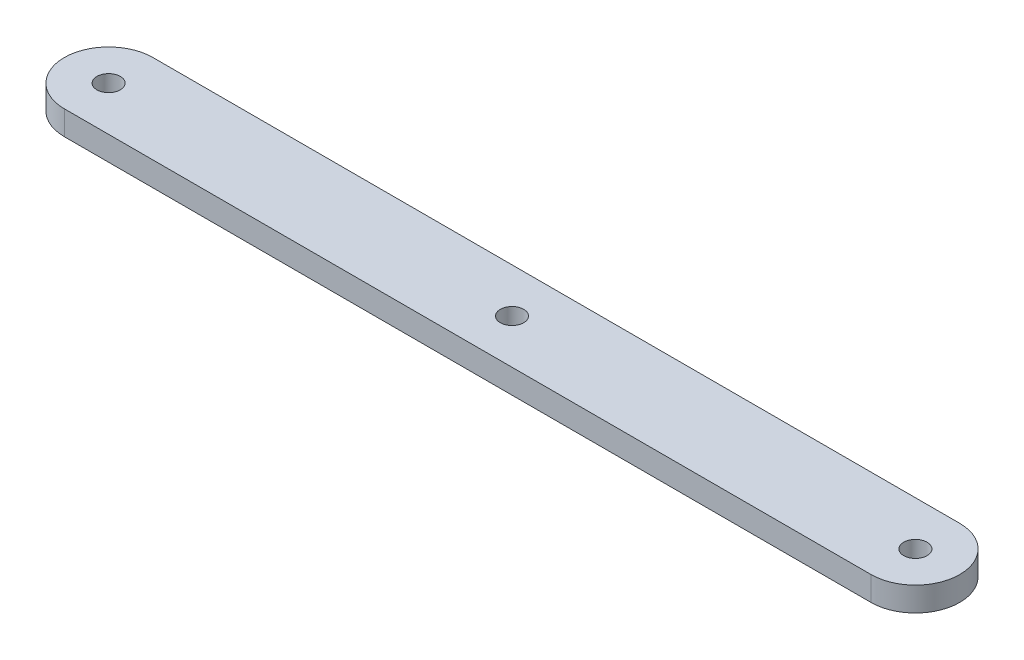
ISO-10303-21;
HEADER;
FILE_DESCRIPTION(('STEP AP214'),'2;1');
FILE_NAME('part.step','',(''),(''),'','','');
FILE_SCHEMA(('AUTOMOTIVE_DESIGN { 1 0 10303 214 1 1 1 1 }'));
ENDSEC;
DATA;
#1=APPLICATION_CONTEXT('core data for automotive mechanical design processes');
#2=APPLICATION_PROTOCOL_DEFINITION('international standard','automotive_design',2000,#1);
#3=PRODUCT_CONTEXT('',#1,'mechanical');
#4=PRODUCT('Part','Part','',(#3));
#5=PRODUCT_RELATED_PRODUCT_CATEGORY('part','',(#4));
#6=PRODUCT_DEFINITION_FORMATION('','',#4);
#7=PRODUCT_DEFINITION_CONTEXT('part definition',#1,'design');
#8=PRODUCT_DEFINITION('design','',#6,#7);
#9=PRODUCT_DEFINITION_SHAPE('','',#8);
#10=(LENGTH_UNIT() NAMED_UNIT(*) SI_UNIT(.MILLI.,.METRE.));
#11=(NAMED_UNIT(*) PLANE_ANGLE_UNIT() SI_UNIT($,.RADIAN.));
#12=(NAMED_UNIT(*) SI_UNIT($,.STERADIAN.) SOLID_ANGLE_UNIT());
#13=UNCERTAINTY_MEASURE_WITH_UNIT(LENGTH_MEASURE(1.E-05),#10,'distance_accuracy_value','');
#14=(GEOMETRIC_REPRESENTATION_CONTEXT(3) GLOBAL_UNCERTAINTY_ASSIGNED_CONTEXT((#13)) GLOBAL_UNIT_ASSIGNED_CONTEXT((#10,
#11,#12)) REPRESENTATION_CONTEXT('',''));
#15=CARTESIAN_POINT('',(0.,0.,0.));
#16=DIRECTION('',(0.,0.,1.));
#17=DIRECTION('',(1.,0.,0.));
#18=AXIS2_PLACEMENT_3D('',#15,#16,#17);
#19=CARTESIAN_POINT('',(0.,4.35,0.));
#20=DIRECTION('',(0.,1.,0.));
#21=DIRECTION('',(0.,0.,1.));
#22=AXIS2_PLACEMENT_3D('',#19,#20,#21);
#23=PLANE('',#22);
#24=CARTESIAN_POINT('',(72.52,4.35,0.));
#25=DIRECTION('',(0.,1.,0.));
#26=DIRECTION('',(0.,0.,1.));
#27=AXIS2_PLACEMENT_3D('',#24,#25,#26);
#28=CIRCLE('',#27,2.1);
#29=CARTESIAN_POINT('',(72.52,4.35,2.1));
#30=VERTEX_POINT('',#29);
#31=EDGE_CURVE('E117',#30,#30,#28,.T.);
#32=ORIENTED_EDGE('',*,*,#31,.F.);
#33=EDGE_LOOP('',(#32));
#34=FACE_BOUND('',#33,.T.);
#35=CARTESIAN_POINT('',(0.,4.35,0.));
#36=DIRECTION('',(0.,1.,0.));
#37=DIRECTION('',(0.,0.,1.));
#38=AXIS2_PLACEMENT_3D('',#35,#36,#37);
#39=CIRCLE('',#38,7.97347609683682);
#40=CARTESIAN_POINT('',(0.,4.35,-7.97347609683682));
#41=VERTEX_POINT('',#40);
#42=CARTESIAN_POINT('',(0.,4.35,7.97347609683682));
#43=VERTEX_POINT('',#42);
#44=EDGE_CURVE('E87',#41,#43,#39,.T.);
#45=ORIENTED_EDGE('',*,*,#44,.T.);
#46=DIRECTION('',(1.,0.,0.));
#47=VECTOR('',#46,1.);
#48=CARTESIAN_POINT('',(0.,4.35,7.97347609683682));
#49=LINE('',#48,#47);
#50=CARTESIAN_POINT('',(145.04,4.35,7.97347609683682));
#51=VERTEX_POINT('',#50);
#52=EDGE_CURVE('E82',#43,#51,#49,.T.);
#53=ORIENTED_EDGE('',*,*,#52,.T.);
#54=CARTESIAN_POINT('',(145.04,4.35,0.));
#55=DIRECTION('',(0.,1.,0.));
#56=DIRECTION('',(0.,0.,1.));
#57=AXIS2_PLACEMENT_3D('',#54,#55,#56);
#58=CIRCLE('',#57,7.97347609683682);
#59=CARTESIAN_POINT('',(145.04,4.35,-7.97347609683682));
#60=VERTEX_POINT('',#59);
#61=EDGE_CURVE('E85',#51,#60,#58,.T.);
#62=ORIENTED_EDGE('',*,*,#61,.T.);
#63=DIRECTION('',(-1.,0.,0.));
#64=VECTOR('',#63,1.);
#65=CARTESIAN_POINT('',(0.,4.35,-7.97347609683682));
#66=LINE('',#65,#64);
#67=EDGE_CURVE('E52',#60,#41,#66,.T.);
#68=ORIENTED_EDGE('',*,*,#67,.T.);
#69=EDGE_LOOP('',(#45,#53,#62,#68));
#70=FACE_BOUND('',#69,.T.);
#71=CARTESIAN_POINT('',(145.04,4.35,0.));
#72=DIRECTION('',(0.,1.,0.));
#73=DIRECTION('',(0.,0.,1.));
#74=AXIS2_PLACEMENT_3D('',#71,#72,#73);
#75=CIRCLE('',#74,2.09999999999999);
#76=CARTESIAN_POINT('',(145.04,4.35,2.09999999999999));
#77=VERTEX_POINT('',#76);
#78=EDGE_CURVE('E102',#77,#77,#75,.T.);
#79=ORIENTED_EDGE('',*,*,#78,.F.);
#80=EDGE_LOOP('',(#79));
#81=FACE_BOUND('',#80,.T.);
#82=CARTESIAN_POINT('',(0.,4.35,0.));
#83=DIRECTION('',(0.,1.,0.));
#84=DIRECTION('',(0.,0.,1.));
#85=AXIS2_PLACEMENT_3D('',#82,#83,#84);
#86=CIRCLE('',#85,2.1);
#87=CARTESIAN_POINT('',(0.,4.35,2.1));
#88=VERTEX_POINT('',#87);
#89=EDGE_CURVE('E123',#88,#88,#86,.T.);
#90=ORIENTED_EDGE('',*,*,#89,.F.);
#91=EDGE_LOOP('',(#90));
#92=FACE_BOUND('',#91,.T.);
#93=ADVANCED_FACE('F35',(#34,#70,#81,#92),#23,.T.);
#94=CARTESIAN_POINT('',(0.,0.,0.));
#95=DIRECTION('',(0.,1.,0.));
#96=DIRECTION('',(0.,0.,1.));
#97=AXIS2_PLACEMENT_3D('',#94,#95,#96);
#98=PLANE('',#97);
#99=CARTESIAN_POINT('',(72.52,0.,0.));
#100=DIRECTION('',(0.,1.,0.));
#101=DIRECTION('',(0.,0.,1.));
#102=AXIS2_PLACEMENT_3D('',#99,#100,#101);
#103=CIRCLE('',#102,2.1);
#104=CARTESIAN_POINT('',(72.52,0.,2.1));
#105=VERTEX_POINT('',#104);
#106=EDGE_CURVE('E120',#105,#105,#103,.T.);
#107=ORIENTED_EDGE('',*,*,#106,.T.);
#108=EDGE_LOOP('',(#107));
#109=FACE_BOUND('',#108,.T.);
#110=CARTESIAN_POINT('',(0.,0.,0.));
#111=DIRECTION('',(0.,1.,0.));
#112=DIRECTION('',(0.,0.,1.));
#113=AXIS2_PLACEMENT_3D('',#110,#111,#112);
#114=CIRCLE('',#113,7.97347609683682);
#115=CARTESIAN_POINT('',(0.,0.,-7.97347609683682));
#116=VERTEX_POINT('',#115);
#117=CARTESIAN_POINT('',(0.,0.,7.97347609683682));
#118=VERTEX_POINT('',#117);
#119=EDGE_CURVE('E99',#116,#118,#114,.T.);
#120=ORIENTED_EDGE('',*,*,#119,.F.);
#121=DIRECTION('',(-1.,0.,0.));
#122=VECTOR('',#121,1.);
#123=CARTESIAN_POINT('',(0.,0.,-7.97347609683682));
#124=LINE('',#123,#122);
#125=CARTESIAN_POINT('',(145.04,0.,-7.97347609683682));
#126=VERTEX_POINT('',#125);
#127=EDGE_CURVE('E75',#126,#116,#124,.T.);
#128=ORIENTED_EDGE('',*,*,#127,.F.);
#129=CARTESIAN_POINT('',(145.04,0.,0.));
#130=DIRECTION('',(0.,1.,0.));
#131=DIRECTION('',(0.,0.,1.));
#132=AXIS2_PLACEMENT_3D('',#129,#130,#131);
#133=CIRCLE('',#132,7.97347609683682);
#134=CARTESIAN_POINT('',(145.04,0.,7.97347609683682));
#135=VERTEX_POINT('',#134);
#136=EDGE_CURVE('E69',#135,#126,#133,.T.);
#137=ORIENTED_EDGE('',*,*,#136,.F.);
#138=DIRECTION('',(1.,0.,0.));
#139=VECTOR('',#138,1.);
#140=CARTESIAN_POINT('',(0.,0.,7.97347609683682));
#141=LINE('',#140,#139);
#142=EDGE_CURVE('E91',#118,#135,#141,.T.);
#143=ORIENTED_EDGE('',*,*,#142,.F.);
#144=EDGE_LOOP('',(#120,#128,#137,#143));
#145=FACE_BOUND('',#144,.T.);
#146=CARTESIAN_POINT('',(145.04,0.,0.));
#147=DIRECTION('',(0.,1.,0.));
#148=DIRECTION('',(0.,0.,1.));
#149=AXIS2_PLACEMENT_3D('',#146,#147,#148);
#150=CIRCLE('',#149,2.09999999999999);
#151=CARTESIAN_POINT('',(145.04,0.,2.09999999999999));
#152=VERTEX_POINT('',#151);
#153=EDGE_CURVE('E114',#152,#152,#150,.T.);
#154=ORIENTED_EDGE('',*,*,#153,.T.);
#155=EDGE_LOOP('',(#154));
#156=FACE_BOUND('',#155,.T.);
#157=CARTESIAN_POINT('',(0.,0.,0.));
#158=DIRECTION('',(0.,1.,0.));
#159=DIRECTION('',(0.,0.,1.));
#160=AXIS2_PLACEMENT_3D('',#157,#158,#159);
#161=CIRCLE('',#160,2.1);
#162=CARTESIAN_POINT('',(0.,0.,2.1));
#163=VERTEX_POINT('',#162);
#164=EDGE_CURVE('E126',#163,#163,#161,.T.);
#165=ORIENTED_EDGE('',*,*,#164,.T.);
#166=EDGE_LOOP('',(#165));
#167=FACE_BOUND('',#166,.T.);
#168=ADVANCED_FACE('F110',(#109,#145,#156,#167),#98,.F.);
#169=CARTESIAN_POINT('',(0.,4.35,0.));
#170=DIRECTION('',(0.,-1.,0.));
#171=DIRECTION('',(0.,0.,-1.));
#172=AXIS2_PLACEMENT_3D('',#169,#170,#171);
#173=CYLINDRICAL_SURFACE('',#172,7.97347609683682);
#174=ORIENTED_EDGE('',*,*,#119,.T.);
#175=DIRECTION('',(0.,-1.,0.));
#176=VECTOR('',#175,1.);
#177=CARTESIAN_POINT('',(0.,4.35,7.97347609683682));
#178=LINE('',#177,#176);
#179=EDGE_CURVE('E11',#43,#118,#178,.T.);
#180=ORIENTED_EDGE('',*,*,#179,.F.);
#181=ORIENTED_EDGE('',*,*,#44,.F.);
#182=DIRECTION('',(0.,-1.,0.));
#183=VECTOR('',#182,1.);
#184=CARTESIAN_POINT('',(0.,4.35,-7.97347609683682));
#185=LINE('',#184,#183);
#186=EDGE_CURVE('E95',#41,#116,#185,.T.);
#187=ORIENTED_EDGE('',*,*,#186,.T.);
#188=EDGE_LOOP('',(#174,#180,#181,#187));
#189=FACE_BOUND('',#188,.T.);
#190=ADVANCED_FACE('F37',(#189),#173,.T.);
#191=CARTESIAN_POINT('',(0.,4.35,7.97347609683682));
#192=DIRECTION('',(0.,0.,-1.));
#193=DIRECTION('',(-1.,0.,0.));
#194=AXIS2_PLACEMENT_3D('',#191,#192,#193);
#195=PLANE('',#194);
#196=ORIENTED_EDGE('',*,*,#142,.T.);
#197=DIRECTION('',(0.,-1.,0.));
#198=VECTOR('',#197,1.);
#199=CARTESIAN_POINT('',(145.04,4.35,7.97347609683682));
#200=LINE('',#199,#198);
#201=EDGE_CURVE('E44',#51,#135,#200,.T.);
#202=ORIENTED_EDGE('',*,*,#201,.F.);
#203=ORIENTED_EDGE('',*,*,#52,.F.);
#204=ORIENTED_EDGE('',*,*,#179,.T.);
#205=EDGE_LOOP('',(#196,#202,#203,#204));
#206=FACE_BOUND('',#205,.T.);
#207=ADVANCED_FACE('F90',(#206),#195,.F.);
#208=CARTESIAN_POINT('',(145.04,4.35,0.));
#209=DIRECTION('',(0.,-1.,0.));
#210=DIRECTION('',(0.,0.,-1.));
#211=AXIS2_PLACEMENT_3D('',#208,#209,#210);
#212=CYLINDRICAL_SURFACE('',#211,7.97347609683682);
#213=ORIENTED_EDGE('',*,*,#136,.T.);
#214=DIRECTION('',(0.,-1.,0.));
#215=VECTOR('',#214,1.);
#216=CARTESIAN_POINT('',(145.04,4.35,-7.97347609683682));
#217=LINE('',#216,#215);
#218=EDGE_CURVE('E92',#60,#126,#217,.T.);
#219=ORIENTED_EDGE('',*,*,#218,.F.);
#220=ORIENTED_EDGE('',*,*,#61,.F.);
#221=ORIENTED_EDGE('',*,*,#201,.T.);
#222=EDGE_LOOP('',(#213,#219,#220,#221));
#223=FACE_BOUND('',#222,.T.);
#224=ADVANCED_FACE('F93',(#223),#212,.T.);
#225=CARTESIAN_POINT('',(0.,4.35,-7.97347609683682));
#226=DIRECTION('',(0.,0.,1.));
#227=DIRECTION('',(1.,0.,0.));
#228=AXIS2_PLACEMENT_3D('',#225,#226,#227);
#229=PLANE('',#228);
#230=ORIENTED_EDGE('',*,*,#127,.T.);
#231=ORIENTED_EDGE('',*,*,#186,.F.);
#232=ORIENTED_EDGE('',*,*,#67,.F.);
#233=ORIENTED_EDGE('',*,*,#218,.T.);
#234=EDGE_LOOP('',(#230,#231,#232,#233));
#235=FACE_BOUND('',#234,.T.);
#236=ADVANCED_FACE('F107',(#235),#229,.F.);
#237=CARTESIAN_POINT('',(145.04,4.35,0.));
#238=DIRECTION('',(0.,-1.,0.));
#239=DIRECTION('',(0.,0.,-1.));
#240=AXIS2_PLACEMENT_3D('',#237,#238,#239);
#241=CYLINDRICAL_SURFACE('',#240,2.09999999999999);
#242=ORIENTED_EDGE('',*,*,#78,.T.);
#243=EDGE_LOOP('',(#242));
#244=FACE_BOUND('',#243,.T.);
#245=ORIENTED_EDGE('',*,*,#153,.F.);
#246=EDGE_LOOP('',(#245));
#247=FACE_BOUND('',#246,.T.);
#248=ADVANCED_FACE('F145',(#244,#247),#241,.F.);
#249=CARTESIAN_POINT('',(72.52,4.35,0.));
#250=DIRECTION('',(0.,-1.,0.));
#251=DIRECTION('',(0.,0.,-1.));
#252=AXIS2_PLACEMENT_3D('',#249,#250,#251);
#253=CYLINDRICAL_SURFACE('',#252,2.1);
#254=ORIENTED_EDGE('',*,*,#31,.T.);
#255=EDGE_LOOP('',(#254));
#256=FACE_BOUND('',#255,.T.);
#257=ORIENTED_EDGE('',*,*,#106,.F.);
#258=EDGE_LOOP('',(#257));
#259=FACE_BOUND('',#258,.T.);
#260=ADVANCED_FACE('F191',(#256,#259),#253,.F.);
#261=CARTESIAN_POINT('',(0.,4.35,0.));
#262=DIRECTION('',(0.,-1.,0.));
#263=DIRECTION('',(0.,0.,-1.));
#264=AXIS2_PLACEMENT_3D('',#261,#262,#263);
#265=CYLINDRICAL_SURFACE('',#264,2.1);
#266=ORIENTED_EDGE('',*,*,#89,.T.);
#267=EDGE_LOOP('',(#266));
#268=FACE_BOUND('',#267,.T.);
#269=ORIENTED_EDGE('',*,*,#164,.F.);
#270=EDGE_LOOP('',(#269));
#271=FACE_BOUND('',#270,.T.);
#272=ADVANCED_FACE('F132',(#268,#271),#265,.F.);
#273=CLOSED_SHELL('',(#93,#168,#190,#207,#224,#236,#248,#260,#272));
#274=MANIFOLD_SOLID_BREP('B2',#273);
#275=ADVANCED_BREP_SHAPE_REPRESENTATION('',(#18,#274),#14);
#276=SHAPE_DEFINITION_REPRESENTATION(#9,#275);
ENDSEC;
END-ISO-10303-21;
